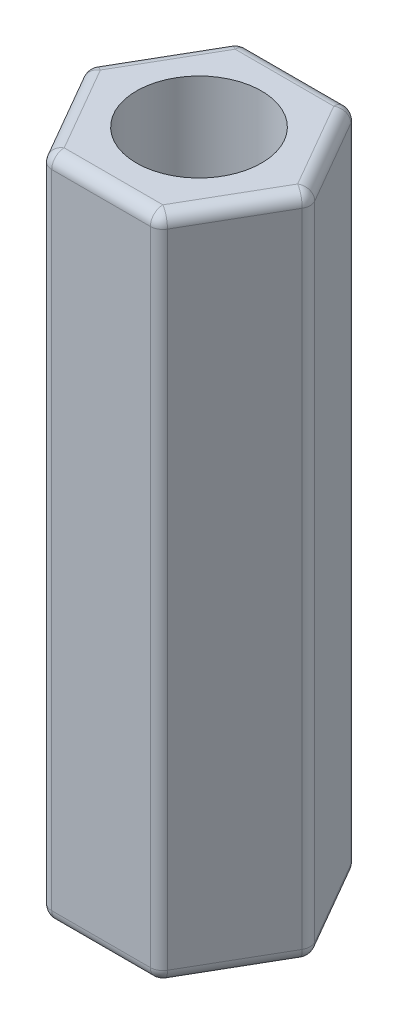
ISO-10303-21;
HEADER;
FILE_DESCRIPTION(('STEP AP214'),'2;1');
FILE_NAME('part.step','',(''),(''),'','','');
FILE_SCHEMA(('AUTOMOTIVE_DESIGN { 1 0 10303 214 1 1 1 1 }'));
ENDSEC;
DATA;
#1=APPLICATION_CONTEXT('core data for automotive mechanical design processes');
#2=APPLICATION_PROTOCOL_DEFINITION('international standard','automotive_design',2000,#1);
#3=PRODUCT_CONTEXT('',#1,'mechanical');
#4=PRODUCT('Part','Part','',(#3));
#5=PRODUCT_RELATED_PRODUCT_CATEGORY('part','',(#4));
#6=PRODUCT_DEFINITION_FORMATION('','',#4);
#7=PRODUCT_DEFINITION_CONTEXT('part definition',#1,'design');
#8=PRODUCT_DEFINITION('design','',#6,#7);
#9=PRODUCT_DEFINITION_SHAPE('','',#8);
#10=(LENGTH_UNIT() NAMED_UNIT(*) SI_UNIT(.MILLI.,.METRE.));
#11=(NAMED_UNIT(*) PLANE_ANGLE_UNIT() SI_UNIT($,.RADIAN.));
#12=(NAMED_UNIT(*) SI_UNIT($,.STERADIAN.) SOLID_ANGLE_UNIT());
#13=UNCERTAINTY_MEASURE_WITH_UNIT(LENGTH_MEASURE(1.E-05),#10,'distance_accuracy_value','');
#14=(GEOMETRIC_REPRESENTATION_CONTEXT(3) GLOBAL_UNCERTAINTY_ASSIGNED_CONTEXT((#13)) GLOBAL_UNIT_ASSIGNED_CONTEXT((#10,
#11,#12)) REPRESENTATION_CONTEXT('',''));
#15=CARTESIAN_POINT('',(0.,0.,0.));
#16=DIRECTION('',(0.,0.,1.));
#17=DIRECTION('',(1.,0.,0.));
#18=AXIS2_PLACEMENT_3D('',#15,#16,#17);
#19=CARTESIAN_POINT('',(0.,16.,0.));
#20=DIRECTION('',(0.,1.,0.));
#21=DIRECTION('',(0.,0.,1.));
#22=AXIS2_PLACEMENT_3D('',#19,#20,#21);
#23=PLANE('',#22);
#24=DIRECTION('',(0.500000000000007,0.,0.866025403784435));
#25=VECTOR('',#24,1.);
#26=CARTESIAN_POINT('',(-1.09696551146027,16.,2.20000000000001));
#27=LINE('',#26,#25);
#28=CARTESIAN_POINT('',(-2.36713610367747,16.,0.));
#29=VERTEX_POINT('',#28);
#30=CARTESIAN_POINT('',(-1.18356805183871,16.,2.05000000000001));
#31=VERTEX_POINT('',#30);
#32=EDGE_CURVE('E255',#29,#31,#27,.T.);
#33=ORIENTED_EDGE('',*,*,#32,.T.);
#34=DIRECTION('',(1.,0.,0.));
#35=VECTOR('',#34,1.);
#36=CARTESIAN_POINT('',(1.35677313259565,16.,2.04999999999999));
#37=LINE('',#36,#35);
#38=CARTESIAN_POINT('',(1.18356805183876,16.,2.04999999999999));
#39=VERTEX_POINT('',#38);
#40=EDGE_CURVE('E257',#31,#39,#37,.T.);
#41=ORIENTED_EDGE('',*,*,#40,.T.);
#42=DIRECTION('',(0.499999999999995,0.,-0.866025403784442));
#43=VECTOR('',#42,1.);
#44=CARTESIAN_POINT('',(2.45373864405591,16.,-0.149999999999999));
#45=LINE('',#44,#43);
#46=CARTESIAN_POINT('',(2.36713610367747,16.,0.));
#47=VERTEX_POINT('',#46);
#48=EDGE_CURVE('E247',#39,#47,#45,.T.);
#49=ORIENTED_EDGE('',*,*,#48,.T.);
#50=DIRECTION('',(-0.500000000000001,0.,-0.866025403784438));
#51=VECTOR('',#50,1.);
#52=CARTESIAN_POINT('',(1.09696551146028,16.,-2.20000000000001));
#53=LINE('',#52,#51);
#54=CARTESIAN_POINT('',(1.18356805183873,16.,-2.05000000000001));
#55=VERTEX_POINT('',#54);
#56=EDGE_CURVE('E249',#47,#55,#53,.T.);
#57=ORIENTED_EDGE('',*,*,#56,.T.);
#58=DIRECTION('',(-1.,0.,0.));
#59=VECTOR('',#58,1.);
#60=CARTESIAN_POINT('',(-1.35677313259563,16.,-2.05));
#61=LINE('',#60,#59);
#62=CARTESIAN_POINT('',(-1.18356805183874,16.,-2.05));
#63=VERTEX_POINT('',#62);
#64=EDGE_CURVE('E251',#55,#63,#61,.T.);
#65=ORIENTED_EDGE('',*,*,#64,.T.);
#66=DIRECTION('',(-0.499999999999995,0.,0.866025403784442));
#67=VECTOR('',#66,1.);
#68=CARTESIAN_POINT('',(-2.45373864405591,16.,0.150000000000018));
#69=LINE('',#68,#67);
#70=EDGE_CURVE('E253',#63,#29,#69,.T.);
#71=ORIENTED_EDGE('',*,*,#70,.T.);
#72=EDGE_LOOP('',(#33,#41,#49,#57,#65,#71));
#73=FACE_BOUND('',#72,.T.);
#74=CARTESIAN_POINT('',(0.,16.,0.));
#75=DIRECTION('',(0.,1.,0.));
#76=DIRECTION('',(0.,0.,1.));
#77=AXIS2_PLACEMENT_3D('',#74,#75,#76);
#78=CIRCLE('',#77,1.5);
#79=CARTESIAN_POINT('',(0.,16.,1.5));
#80=VERTEX_POINT('',#79);
#81=EDGE_CURVE('E194',#80,#80,#78,.T.);
#82=ORIENTED_EDGE('',*,*,#81,.F.);
#83=EDGE_LOOP('',(#82));
#84=FACE_BOUND('',#83,.T.);
#85=ADVANCED_FACE('F37',(#73,#84),#23,.T.);
#86=CARTESIAN_POINT('',(0.,0.,0.));
#87=DIRECTION('',(0.,1.,0.));
#88=DIRECTION('',(0.,0.,1.));
#89=AXIS2_PLACEMENT_3D('',#86,#87,#88);
#90=PLANE('',#89);
#91=DIRECTION('',(0.499999999999995,0.,-0.866025403784442));
#92=VECTOR('',#91,1.);
#93=CARTESIAN_POINT('',(1.77535207775811,0.,1.02499999999999));
#94=LINE('',#93,#92);
#95=CARTESIAN_POINT('',(2.36713610367747,0.,0.));
#96=VERTEX_POINT('',#95);
#97=CARTESIAN_POINT('',(1.18356805183876,0.,2.04999999999999));
#98=VERTEX_POINT('',#97);
#99=EDGE_CURVE('E260',#96,#98,#94,.F.);
#100=ORIENTED_EDGE('',*,*,#99,.T.);
#101=DIRECTION('',(1.,0.,0.));
#102=VECTOR('',#101,1.);
#103=CARTESIAN_POINT('',(0.,0.,2.05));
#104=LINE('',#103,#102);
#105=CARTESIAN_POINT('',(-1.18356805183871,0.,2.05000000000001));
#106=VERTEX_POINT('',#105);
#107=EDGE_CURVE('E11',#98,#106,#104,.F.);
#108=ORIENTED_EDGE('',*,*,#107,.T.);
#109=DIRECTION('',(0.500000000000007,0.,0.866025403784435));
#110=VECTOR('',#109,1.);
#111=CARTESIAN_POINT('',(-1.77535207775809,0.,1.02500000000001));
#112=LINE('',#111,#110);
#113=CARTESIAN_POINT('',(-2.36713610367747,0.,0.));
#114=VERTEX_POINT('',#113);
#115=EDGE_CURVE('E46',#106,#114,#112,.F.);
#116=ORIENTED_EDGE('',*,*,#115,.T.);
#117=DIRECTION('',(-0.499999999999995,0.,0.866025403784442));
#118=VECTOR('',#117,1.);
#119=CARTESIAN_POINT('',(-1.77535207775811,0.,-1.02499999999999));
#120=LINE('',#119,#118);
#121=CARTESIAN_POINT('',(-1.18356805183874,0.,-2.05));
#122=VERTEX_POINT('',#121);
#123=EDGE_CURVE('E266',#114,#122,#120,.F.);
#124=ORIENTED_EDGE('',*,*,#123,.T.);
#125=DIRECTION('',(-1.,0.,0.));
#126=VECTOR('',#125,1.);
#127=CARTESIAN_POINT('',(0.,0.,-2.05));
#128=LINE('',#127,#126);
#129=CARTESIAN_POINT('',(1.18356805183873,0.,-2.05000000000001));
#130=VERTEX_POINT('',#129);
#131=EDGE_CURVE('E264',#122,#130,#128,.F.);
#132=ORIENTED_EDGE('',*,*,#131,.T.);
#133=DIRECTION('',(-0.500000000000001,0.,-0.866025403784438));
#134=VECTOR('',#133,1.);
#135=CARTESIAN_POINT('',(1.7753520777581,0.,-1.025));
#136=LINE('',#135,#134);
#137=EDGE_CURVE('E262',#130,#96,#136,.F.);
#138=ORIENTED_EDGE('',*,*,#137,.T.);
#139=EDGE_LOOP('',(#100,#108,#116,#124,#132,#138));
#140=FACE_BOUND('',#139,.T.);
#141=CARTESIAN_POINT('',(0.,0.,0.));
#142=DIRECTION('',(0.,1.,0.));
#143=DIRECTION('',(0.,0.,1.));
#144=AXIS2_PLACEMENT_3D('',#141,#142,#143);
#145=CIRCLE('',#144,1.5);
#146=CARTESIAN_POINT('',(0.,0.,1.5));
#147=VERTEX_POINT('',#146);
#148=EDGE_CURVE('E358',#147,#147,#145,.T.);
#149=ORIENTED_EDGE('',*,*,#148,.T.);
#150=EDGE_LOOP('',(#149));
#151=FACE_BOUND('',#150,.T.);
#152=ADVANCED_FACE('F375',(#140,#151),#90,.F.);
#153=CARTESIAN_POINT('',(1.35677313259565,16.,2.34999999999999));
#154=DIRECTION('',(-0.866025403784441,0.,-0.499999999999995));
#155=DIRECTION('',(-0.499999999999995,0.,0.866025403784442));
#156=AXIS2_PLACEMENT_3D('',#153,#154,#155);
#157=PLANE('',#156);
#158=DIRECTION('',(0.,-1.,0.));
#159=VECTOR('',#158,1.);
#160=CARTESIAN_POINT('',(2.6269437248128,16.,0.15));
#161=LINE('',#160,#159);
#162=CARTESIAN_POINT('',(2.6269437248128,0.300000000000002,0.15));
#163=VERTEX_POINT('',#162);
#164=CARTESIAN_POINT('',(2.6269437248128,15.7,0.15));
#165=VERTEX_POINT('',#164);
#166=EDGE_CURVE('E171',#163,#165,#161,.F.);
#167=ORIENTED_EDGE('',*,*,#166,.T.);
#168=DIRECTION('',(0.499999999999995,0.,-0.866025403784442));
#169=VECTOR('',#168,1.);
#170=CARTESIAN_POINT('',(1.35677313259565,15.7,2.34999999999999));
#171=LINE('',#170,#169);
#172=CARTESIAN_POINT('',(1.44337567297409,15.7,2.19999999999999));
#173=VERTEX_POINT('',#172);
#174=EDGE_CURVE('E209',#165,#173,#171,.F.);
#175=ORIENTED_EDGE('',*,*,#174,.T.);
#176=DIRECTION('',(0.,-1.,0.));
#177=VECTOR('',#176,1.);
#178=CARTESIAN_POINT('',(1.44337567297409,16.,2.19999999999999));
#179=LINE('',#178,#177);
#180=CARTESIAN_POINT('',(1.44337567297409,0.300000000000002,2.19999999999999));
#181=VERTEX_POINT('',#180);
#182=EDGE_CURVE('E206',#173,#181,#179,.T.);
#183=ORIENTED_EDGE('',*,*,#182,.T.);
#184=DIRECTION('',(0.499999999999995,0.,-0.866025403784442));
#185=VECTOR('',#184,1.);
#186=CARTESIAN_POINT('',(1.35677313259565,0.300000000000002,2.34999999999999));
#187=LINE('',#186,#185);
#188=EDGE_CURVE('E201',#181,#163,#187,.T.);
#189=ORIENTED_EDGE('',*,*,#188,.T.);
#190=EDGE_LOOP('',(#167,#175,#183,#189));
#191=FACE_BOUND('',#190,.T.);
#192=ADVANCED_FACE('F381',(#191),#157,.F.);
#193=CARTESIAN_POINT('',(2.71354626519124,16.,0.));
#194=DIRECTION('',(-0.866025403784438,0.,0.500000000000001));
#195=DIRECTION('',(0.500000000000001,0.,0.866025403784438));
#196=AXIS2_PLACEMENT_3D('',#193,#194,#195);
#197=PLANE('',#196);
#198=DIRECTION('',(0.,-1.,0.));
#199=VECTOR('',#198,1.);
#200=CARTESIAN_POINT('',(1.44337567297406,16.,-2.20000000000001));
#201=LINE('',#200,#199);
#202=CARTESIAN_POINT('',(1.44337567297406,0.300000000000002,-2.20000000000001));
#203=VERTEX_POINT('',#202);
#204=CARTESIAN_POINT('',(1.44337567297406,15.7,-2.20000000000001));
#205=VERTEX_POINT('',#204);
#206=EDGE_CURVE('E193',#203,#205,#201,.F.);
#207=ORIENTED_EDGE('',*,*,#206,.T.);
#208=DIRECTION('',(-0.500000000000001,0.,-0.866025403784438));
#209=VECTOR('',#208,1.);
#210=CARTESIAN_POINT('',(2.71354626519124,15.7,0.));
#211=LINE('',#210,#209);
#212=CARTESIAN_POINT('',(2.6269437248128,15.7,-0.149999999999999));
#213=VERTEX_POINT('',#212);
#214=EDGE_CURVE('E198',#205,#213,#211,.F.);
#215=ORIENTED_EDGE('',*,*,#214,.T.);
#216=DIRECTION('',(0.,-1.,0.));
#217=VECTOR('',#216,1.);
#218=CARTESIAN_POINT('',(2.6269437248128,16.,-0.149999999999999));
#219=LINE('',#218,#217);
#220=CARTESIAN_POINT('',(2.6269437248128,0.300000000000002,-0.149999999999999));
#221=VERTEX_POINT('',#220);
#222=EDGE_CURVE('E169',#213,#221,#219,.T.);
#223=ORIENTED_EDGE('',*,*,#222,.T.);
#224=DIRECTION('',(-0.500000000000001,0.,-0.866025403784438));
#225=VECTOR('',#224,1.);
#226=CARTESIAN_POINT('',(2.71354626519124,0.300000000000002,0.));
#227=LINE('',#226,#225);
#228=EDGE_CURVE('E187',#221,#203,#227,.T.);
#229=ORIENTED_EDGE('',*,*,#228,.T.);
#230=EDGE_LOOP('',(#207,#215,#223,#229));
#231=FACE_BOUND('',#230,.T.);
#232=ADVANCED_FACE('F196',(#231),#197,.F.);
#233=CARTESIAN_POINT('',(1.35677313259562,16.,-2.35000000000001));
#234=DIRECTION('',(0.,0.,1.));
#235=DIRECTION('',(1.,0.,0.));
#236=AXIS2_PLACEMENT_3D('',#233,#234,#235);
#237=PLANE('',#236);
#238=DIRECTION('',(0.,-1.,0.));
#239=VECTOR('',#238,1.);
#240=CARTESIAN_POINT('',(-1.18356805183874,16.,-2.35));
#241=LINE('',#240,#239);
#242=CARTESIAN_POINT('',(-1.18356805183874,0.300000000000002,-2.35));
#243=VERTEX_POINT('',#242);
#244=CARTESIAN_POINT('',(-1.18356805183874,15.7,-2.35));
#245=VERTEX_POINT('',#244);
#246=EDGE_CURVE('E213',#243,#245,#241,.F.);
#247=ORIENTED_EDGE('',*,*,#246,.T.);
#248=DIRECTION('',(-1.,0.,0.));
#249=VECTOR('',#248,1.);
#250=CARTESIAN_POINT('',(1.35677313259562,15.7,-2.35000000000001));
#251=LINE('',#250,#249);
#252=CARTESIAN_POINT('',(1.18356805183873,15.7,-2.35));
#253=VERTEX_POINT('',#252);
#254=EDGE_CURVE('E218',#245,#253,#251,.F.);
#255=ORIENTED_EDGE('',*,*,#254,.T.);
#256=DIRECTION('',(0.,-1.,0.));
#257=VECTOR('',#256,1.);
#258=CARTESIAN_POINT('',(1.18356805183873,16.,-2.35));
#259=LINE('',#258,#257);
#260=CARTESIAN_POINT('',(1.18356805183873,0.300000000000002,-2.35));
#261=VERTEX_POINT('',#260);
#262=EDGE_CURVE('E215',#253,#261,#259,.T.);
#263=ORIENTED_EDGE('',*,*,#262,.T.);
#264=DIRECTION('',(-1.,0.,0.));
#265=VECTOR('',#264,1.);
#266=CARTESIAN_POINT('',(1.35677313259562,0.300000000000002,-2.35000000000001));
#267=LINE('',#266,#265);
#268=EDGE_CURVE('E211',#261,#243,#267,.T.);
#269=ORIENTED_EDGE('',*,*,#268,.T.);
#270=EDGE_LOOP('',(#247,#255,#263,#269));
#271=FACE_BOUND('',#270,.T.);
#272=ADVANCED_FACE('F396',(#271),#237,.F.);
#273=CARTESIAN_POINT('',(-1.35677313259563,16.,-2.35));
#274=DIRECTION('',(0.866025403784442,0.,0.499999999999995));
#275=DIRECTION('',(0.499999999999995,0.,-0.866025403784442));
#276=AXIS2_PLACEMENT_3D('',#273,#274,#275);
#277=PLANE('',#276);
#278=DIRECTION('',(0.,-1.,0.));
#279=VECTOR('',#278,1.);
#280=CARTESIAN_POINT('',(-2.6269437248128,16.,-0.149999999999982));
#281=LINE('',#280,#279);
#282=CARTESIAN_POINT('',(-2.6269437248128,0.300000000000002,-0.149999999999981));
#283=VERTEX_POINT('',#282);
#284=CARTESIAN_POINT('',(-2.6269437248128,15.7,-0.149999999999981));
#285=VERTEX_POINT('',#284);
#286=EDGE_CURVE('E222',#283,#285,#281,.F.);
#287=ORIENTED_EDGE('',*,*,#286,.T.);
#288=DIRECTION('',(-0.499999999999995,0.,0.866025403784442));
#289=VECTOR('',#288,1.);
#290=CARTESIAN_POINT('',(-1.35677313259563,15.7,-2.35));
#291=LINE('',#290,#289);
#292=CARTESIAN_POINT('',(-1.44337567297408,15.7,-2.19999999999999));
#293=VERTEX_POINT('',#292);
#294=EDGE_CURVE('E227',#285,#293,#291,.F.);
#295=ORIENTED_EDGE('',*,*,#294,.T.);
#296=DIRECTION('',(0.,-1.,0.));
#297=VECTOR('',#296,1.);
#298=CARTESIAN_POINT('',(-1.44337567297408,16.,-2.19999999999999));
#299=LINE('',#298,#297);
#300=CARTESIAN_POINT('',(-1.44337567297408,0.300000000000002,-2.19999999999999));
#301=VERTEX_POINT('',#300);
#302=EDGE_CURVE('E224',#293,#301,#299,.T.);
#303=ORIENTED_EDGE('',*,*,#302,.T.);
#304=DIRECTION('',(-0.499999999999995,0.,0.866025403784442));
#305=VECTOR('',#304,1.);
#306=CARTESIAN_POINT('',(-1.35677313259563,0.300000000000002,-2.35));
#307=LINE('',#306,#305);
#308=EDGE_CURVE('E220',#301,#283,#307,.T.);
#309=ORIENTED_EDGE('',*,*,#308,.T.);
#310=EDGE_LOOP('',(#287,#295,#303,#309));
#311=FACE_BOUND('',#310,.T.);
#312=ADVANCED_FACE('F392',(#311),#277,.F.);
#313=CARTESIAN_POINT('',(-2.71354626519124,16.,0.));
#314=DIRECTION('',(0.866025403784435,0.,-0.500000000000007));
#315=DIRECTION('',(-0.500000000000007,0.,-0.866025403784435));
#316=AXIS2_PLACEMENT_3D('',#313,#314,#315);
#317=PLANE('',#316);
#318=DIRECTION('',(0.,-1.,0.));
#319=VECTOR('',#318,1.);
#320=CARTESIAN_POINT('',(-1.44337567297404,16.,2.20000000000001));
#321=LINE('',#320,#319);
#322=CARTESIAN_POINT('',(-1.44337567297405,0.300000000000002,2.20000000000001));
#323=VERTEX_POINT('',#322);
#324=CARTESIAN_POINT('',(-1.44337567297405,15.7,2.20000000000001));
#325=VERTEX_POINT('',#324);
#326=EDGE_CURVE('E231',#323,#325,#321,.F.);
#327=ORIENTED_EDGE('',*,*,#326,.T.);
#328=DIRECTION('',(0.500000000000007,0.,0.866025403784435));
#329=VECTOR('',#328,1.);
#330=CARTESIAN_POINT('',(-2.71354626519124,15.7,0.));
#331=LINE('',#330,#329);
#332=CARTESIAN_POINT('',(-2.6269437248128,15.7,0.150000000000019));
#333=VERTEX_POINT('',#332);
#334=EDGE_CURVE('E236',#325,#333,#331,.F.);
#335=ORIENTED_EDGE('',*,*,#334,.T.);
#336=DIRECTION('',(0.,-1.,0.));
#337=VECTOR('',#336,1.);
#338=CARTESIAN_POINT('',(-2.6269437248128,16.,0.150000000000019));
#339=LINE('',#338,#337);
#340=CARTESIAN_POINT('',(-2.6269437248128,0.300000000000002,0.150000000000019));
#341=VERTEX_POINT('',#340);
#342=EDGE_CURVE('E233',#333,#341,#339,.T.);
#343=ORIENTED_EDGE('',*,*,#342,.T.);
#344=DIRECTION('',(0.500000000000007,0.,0.866025403784435));
#345=VECTOR('',#344,1.);
#346=CARTESIAN_POINT('',(-2.71354626519124,0.300000000000002,0.));
#347=LINE('',#346,#345);
#348=EDGE_CURVE('E229',#341,#323,#347,.T.);
#349=ORIENTED_EDGE('',*,*,#348,.T.);
#350=EDGE_LOOP('',(#327,#335,#343,#349));
#351=FACE_BOUND('',#350,.T.);
#352=ADVANCED_FACE('F388',(#351),#317,.F.);
#353=CARTESIAN_POINT('',(-1.3567731325956,16.,2.35000000000001));
#354=DIRECTION('',(0.,0.,-1.));
#355=DIRECTION('',(-1.,0.,0.));
#356=AXIS2_PLACEMENT_3D('',#353,#354,#355);
#357=PLANE('',#356);
#358=DIRECTION('',(0.,-1.,0.));
#359=VECTOR('',#358,1.);
#360=CARTESIAN_POINT('',(1.18356805183876,16.,2.34999999999999));
#361=LINE('',#360,#359);
#362=CARTESIAN_POINT('',(1.18356805183876,0.300000000000002,2.34999999999999));
#363=VERTEX_POINT('',#362);
#364=CARTESIAN_POINT('',(1.18356805183876,15.7,2.34999999999999));
#365=VERTEX_POINT('',#364);
#366=EDGE_CURVE('E240',#363,#365,#361,.F.);
#367=ORIENTED_EDGE('',*,*,#366,.T.);
#368=DIRECTION('',(1.,0.,0.));
#369=VECTOR('',#368,1.);
#370=CARTESIAN_POINT('',(-1.3567731325956,15.7,2.35000000000001));
#371=LINE('',#370,#369);
#372=CARTESIAN_POINT('',(-1.18356805183871,15.7,2.35000000000001));
#373=VERTEX_POINT('',#372);
#374=EDGE_CURVE('E245',#365,#373,#371,.F.);
#375=ORIENTED_EDGE('',*,*,#374,.T.);
#376=DIRECTION('',(0.,-1.,0.));
#377=VECTOR('',#376,1.);
#378=CARTESIAN_POINT('',(-1.18356805183871,16.,2.35000000000001));
#379=LINE('',#378,#377);
#380=CARTESIAN_POINT('',(-1.18356805183871,0.300000000000002,2.35000000000001));
#381=VERTEX_POINT('',#380);
#382=EDGE_CURVE('E242',#373,#381,#379,.T.);
#383=ORIENTED_EDGE('',*,*,#382,.T.);
#384=DIRECTION('',(1.,0.,0.));
#385=VECTOR('',#384,1.);
#386=CARTESIAN_POINT('',(-1.3567731325956,0.300000000000002,2.35000000000001));
#387=LINE('',#386,#385);
#388=EDGE_CURVE('E238',#381,#363,#387,.T.);
#389=ORIENTED_EDGE('',*,*,#388,.T.);
#390=EDGE_LOOP('',(#367,#375,#383,#389));
#391=FACE_BOUND('',#390,.T.);
#392=ADVANCED_FACE('F385',(#391),#357,.F.);
#393=CARTESIAN_POINT('',(0.,16.,0.));
#394=DIRECTION('',(0.,-1.,0.));
#395=DIRECTION('',(0.,0.,-1.));
#396=AXIS2_PLACEMENT_3D('',#393,#394,#395);
#397=CYLINDRICAL_SURFACE('',#396,1.5);
#398=ORIENTED_EDGE('',*,*,#81,.T.);
#399=EDGE_LOOP('',(#398));
#400=FACE_BOUND('',#399,.T.);
#401=ORIENTED_EDGE('',*,*,#148,.F.);
#402=EDGE_LOOP('',(#401));
#403=FACE_BOUND('',#402,.T.);
#404=ADVANCED_FACE('F371',(#400,#403),#397,.F.);
#405=CARTESIAN_POINT('',(-2.36713610367747,16.,0.));
#406=DIRECTION('',(0.,-1.,0.));
#407=DIRECTION('',(0.,0.,-1.));
#408=AXIS2_PLACEMENT_3D('',#405,#406,#407);
#409=CYLINDRICAL_SURFACE('',#408,0.3);
#410=CARTESIAN_POINT('',(-2.36713610367747,15.7,0.));
#411=DIRECTION('',(0.,1.,0.));
#412=DIRECTION('',(0.,0.,1.));
#413=AXIS2_PLACEMENT_3D('',#410,#411,#412);
#414=CIRCLE('',#413,0.3);
#415=EDGE_CURVE('E41',#285,#333,#414,.T.);
#416=ORIENTED_EDGE('',*,*,#415,.F.);
#417=ORIENTED_EDGE('',*,*,#286,.F.);
#418=CARTESIAN_POINT('',(-2.36713610367747,0.300000000000002,0.));
#419=DIRECTION('',(0.,-1.,0.));
#420=DIRECTION('',(0.,0.,-1.));
#421=AXIS2_PLACEMENT_3D('',#418,#419,#420);
#422=CIRCLE('',#421,0.3);
#423=EDGE_CURVE('E351',#341,#283,#422,.T.);
#424=ORIENTED_EDGE('',*,*,#423,.F.);
#425=ORIENTED_EDGE('',*,*,#342,.F.);
#426=EDGE_LOOP('',(#416,#417,#424,#425));
#427=FACE_BOUND('',#426,.T.);
#428=ADVANCED_FACE('F39',(#427),#409,.T.);
#429=CARTESIAN_POINT('',(-2.36713610367747,15.7,0.));
#430=DIRECTION('',(0.,0.,1.));
#431=DIRECTION('',(1.,0.,0.));
#432=AXIS2_PLACEMENT_3D('',#429,#430,#431);
#433=SPHERICAL_SURFACE('',#432,0.3);
#434=CARTESIAN_POINT('',(-2.36713610367747,15.7,0.));
#435=DIRECTION('',(-0.499999999999994,0.,0.866025403784442));
#436=DIRECTION('',(0.866025403784442,0.,0.499999999999994));
#437=AXIS2_PLACEMENT_3D('',#434,#435,#436);
#438=CIRCLE('',#437,0.3);
#439=EDGE_CURVE('E346',#285,#29,#438,.F.);
#440=ORIENTED_EDGE('',*,*,#439,.F.);
#441=ORIENTED_EDGE('',*,*,#415,.T.);
#442=CARTESIAN_POINT('',(-2.36713610367747,15.7,0.));
#443=DIRECTION('',(-0.500000000000007,0.,-0.866025403784435));
#444=DIRECTION('',(-0.866025403784435,0.,0.500000000000007));
#445=AXIS2_PLACEMENT_3D('',#442,#443,#444);
#446=CIRCLE('',#445,0.3);
#447=EDGE_CURVE('E349',#29,#333,#446,.F.);
#448=ORIENTED_EDGE('',*,*,#447,.F.);
#449=EDGE_LOOP('',(#440,#441,#448));
#450=FACE_BOUND('',#449,.T.);
#451=ADVANCED_FACE('F509',(#450),#433,.T.);
#452=CARTESIAN_POINT('',(-2.36713610367747,0.3,0.));
#453=DIRECTION('',(0.,0.,1.));
#454=DIRECTION('',(1.,0.,0.));
#455=AXIS2_PLACEMENT_3D('',#452,#453,#454);
#456=SPHERICAL_SURFACE('',#455,0.3);
#457=CARTESIAN_POINT('',(-2.36713610367747,0.3,0.));
#458=DIRECTION('',(-0.500000000000007,0.,-0.866025403784435));
#459=DIRECTION('',(-0.866025403784435,0.,0.500000000000007));
#460=AXIS2_PLACEMENT_3D('',#457,#458,#459);
#461=CIRCLE('',#460,0.3);
#462=EDGE_CURVE('E341',#341,#114,#461,.F.);
#463=ORIENTED_EDGE('',*,*,#462,.F.);
#464=ORIENTED_EDGE('',*,*,#423,.T.);
#465=CARTESIAN_POINT('',(-2.36713610367747,0.300000000000002,0.));
#466=DIRECTION('',(-0.499999999999995,0.,0.866025403784442));
#467=DIRECTION('',(0.866025403784442,0.,0.499999999999995));
#468=AXIS2_PLACEMENT_3D('',#465,#466,#467);
#469=CIRCLE('',#468,0.3);
#470=EDGE_CURVE('E343',#114,#283,#469,.F.);
#471=ORIENTED_EDGE('',*,*,#470,.F.);
#472=EDGE_LOOP('',(#463,#464,#471));
#473=FACE_BOUND('',#472,.T.);
#474=ADVANCED_FACE('F506',(#473),#456,.T.);
#475=CARTESIAN_POINT('',(-1.77535207775809,15.7,1.02500000000001));
#476=DIRECTION('',(-0.500000000000007,0.,-0.866025403784435));
#477=DIRECTION('',(-0.866025403784435,0.,0.500000000000007));
#478=AXIS2_PLACEMENT_3D('',#475,#476,#477);
#479=CYLINDRICAL_SURFACE('',#478,0.3);
#480=ORIENTED_EDGE('',*,*,#447,.T.);
#481=ORIENTED_EDGE('',*,*,#334,.F.);
#482=CARTESIAN_POINT('',(-1.18356805183871,15.7,2.05000000000001));
#483=DIRECTION('',(0.500000000000007,0.,0.866025403784434));
#484=DIRECTION('',(0.866025403784435,0.,-0.500000000000007));
#485=AXIS2_PLACEMENT_3D('',#482,#483,#484);
#486=CIRCLE('',#485,0.3);
#487=EDGE_CURVE('E335',#31,#325,#486,.T.);
#488=ORIENTED_EDGE('',*,*,#487,.F.);
#489=ORIENTED_EDGE('',*,*,#32,.F.);
#490=EDGE_LOOP('',(#480,#481,#488,#489));
#491=FACE_BOUND('',#490,.T.);
#492=ADVANCED_FACE('F502',(#491),#479,.T.);
#493=CARTESIAN_POINT('',(-1.77535207775811,15.7,-1.02499999999999));
#494=DIRECTION('',(0.499999999999995,0.,-0.866025403784442));
#495=DIRECTION('',(-0.866025403784442,0.,-0.499999999999995));
#496=AXIS2_PLACEMENT_3D('',#493,#494,#495);
#497=CYLINDRICAL_SURFACE('',#496,0.3);
#498=ORIENTED_EDGE('',*,*,#439,.T.);
#499=ORIENTED_EDGE('',*,*,#70,.F.);
#500=CARTESIAN_POINT('',(-1.18356805183874,15.7,-2.05));
#501=DIRECTION('',(0.499999999999995,0.,-0.866025403784441));
#502=DIRECTION('',(-0.866025403784441,0.,-0.499999999999995));
#503=AXIS2_PLACEMENT_3D('',#500,#501,#502);
#504=CIRCLE('',#503,0.3);
#505=EDGE_CURVE('E332',#293,#63,#504,.T.);
#506=ORIENTED_EDGE('',*,*,#505,.F.);
#507=ORIENTED_EDGE('',*,*,#294,.F.);
#508=EDGE_LOOP('',(#498,#499,#506,#507));
#509=FACE_BOUND('',#508,.T.);
#510=ADVANCED_FACE('F498',(#509),#497,.T.);
#511=CARTESIAN_POINT('',(-1.18356805183874,16.,-2.05));
#512=DIRECTION('',(0.,-1.,0.));
#513=DIRECTION('',(0.,0.,-1.));
#514=AXIS2_PLACEMENT_3D('',#511,#512,#513);
#515=CYLINDRICAL_SURFACE('',#514,0.3);
#516=CARTESIAN_POINT('',(-1.18356805183874,0.300000000000002,-2.05));
#517=DIRECTION('',(0.,-1.,0.));
#518=DIRECTION('',(0.,0.,-1.));
#519=AXIS2_PLACEMENT_3D('',#516,#517,#518);
#520=CIRCLE('',#519,0.3);
#521=EDGE_CURVE('E326',#301,#243,#520,.T.);
#522=ORIENTED_EDGE('',*,*,#521,.F.);
#523=ORIENTED_EDGE('',*,*,#302,.F.);
#524=CARTESIAN_POINT('',(-1.18356805183874,15.7,-2.05));
#525=DIRECTION('',(0.,1.,0.));
#526=DIRECTION('',(0.,0.,1.));
#527=AXIS2_PLACEMENT_3D('',#524,#525,#526);
#528=CIRCLE('',#527,0.3);
#529=EDGE_CURVE('E329',#245,#293,#528,.T.);
#530=ORIENTED_EDGE('',*,*,#529,.F.);
#531=ORIENTED_EDGE('',*,*,#246,.F.);
#532=EDGE_LOOP('',(#522,#523,#530,#531));
#533=FACE_BOUND('',#532,.T.);
#534=ADVANCED_FACE('F494',(#533),#515,.T.);
#535=CARTESIAN_POINT('',(-1.0969655114603,0.300000000000002,-2.2));
#536=DIRECTION('',(-0.499999999999995,0.,0.866025403784442));
#537=DIRECTION('',(0.866025403784442,0.,0.499999999999995));
#538=AXIS2_PLACEMENT_3D('',#535,#536,#537);
#539=CYLINDRICAL_SURFACE('',#538,0.3);
#540=ORIENTED_EDGE('',*,*,#470,.T.);
#541=ORIENTED_EDGE('',*,*,#308,.F.);
#542=CARTESIAN_POINT('',(-1.18356805183874,0.3,-2.05));
#543=DIRECTION('',(0.499999999999995,0.,-0.866025403784441));
#544=DIRECTION('',(-0.866025403784441,0.,-0.499999999999995));
#545=AXIS2_PLACEMENT_3D('',#542,#543,#544);
#546=CIRCLE('',#545,0.3);
#547=EDGE_CURVE('E324',#122,#301,#546,.T.);
#548=ORIENTED_EDGE('',*,*,#547,.F.);
#549=ORIENTED_EDGE('',*,*,#123,.F.);
#550=EDGE_LOOP('',(#540,#541,#548,#549));
#551=FACE_BOUND('',#550,.T.);
#552=ADVANCED_FACE('F490',(#551),#539,.T.);
#553=CARTESIAN_POINT('',(-2.45373864405591,0.300000000000002,-0.149999999999983));
#554=DIRECTION('',(0.500000000000007,0.,0.866025403784435));
#555=DIRECTION('',(0.866025403784435,0.,-0.500000000000007));
#556=AXIS2_PLACEMENT_3D('',#553,#554,#555);
#557=CYLINDRICAL_SURFACE('',#556,0.3);
#558=ORIENTED_EDGE('',*,*,#462,.T.);
#559=ORIENTED_EDGE('',*,*,#115,.F.);
#560=CARTESIAN_POINT('',(-1.18356805183871,0.300000000000002,2.05000000000001));
#561=DIRECTION('',(0.500000000000007,0.,0.866025403784435));
#562=DIRECTION('',(0.866025403784435,0.,-0.500000000000007));
#563=AXIS2_PLACEMENT_3D('',#560,#561,#562);
#564=CIRCLE('',#563,0.3);
#565=EDGE_CURVE('E322',#323,#106,#564,.T.);
#566=ORIENTED_EDGE('',*,*,#565,.F.);
#567=ORIENTED_EDGE('',*,*,#348,.F.);
#568=EDGE_LOOP('',(#558,#559,#566,#567));
#569=FACE_BOUND('',#568,.T.);
#570=ADVANCED_FACE('F486',(#569),#557,.T.);
#571=CARTESIAN_POINT('',(-1.18356805183871,16.,2.05000000000001));
#572=DIRECTION('',(0.,-1.,0.));
#573=DIRECTION('',(0.,0.,-1.));
#574=AXIS2_PLACEMENT_3D('',#571,#572,#573);
#575=CYLINDRICAL_SURFACE('',#574,0.3);
#576=CARTESIAN_POINT('',(-1.18356805183871,15.7,2.05000000000001));
#577=DIRECTION('',(0.,1.,0.));
#578=DIRECTION('',(0.,0.,1.));
#579=AXIS2_PLACEMENT_3D('',#576,#577,#578);
#580=CIRCLE('',#579,0.3);
#581=EDGE_CURVE('E338',#325,#373,#580,.T.);
#582=ORIENTED_EDGE('',*,*,#581,.F.);
#583=ORIENTED_EDGE('',*,*,#326,.F.);
#584=CARTESIAN_POINT('',(-1.18356805183871,0.300000000000002,2.05000000000001));
#585=DIRECTION('',(0.,-1.,0.));
#586=DIRECTION('',(0.,0.,-1.));
#587=AXIS2_PLACEMENT_3D('',#584,#585,#586);
#588=CIRCLE('',#587,0.3);
#589=EDGE_CURVE('E319',#381,#323,#588,.T.);
#590=ORIENTED_EDGE('',*,*,#589,.F.);
#591=ORIENTED_EDGE('',*,*,#382,.F.);
#592=EDGE_LOOP('',(#582,#583,#590,#591));
#593=FACE_BOUND('',#592,.T.);
#594=ADVANCED_FACE('F482',(#593),#575,.T.);
#595=CARTESIAN_POINT('',(-1.18356805183871,15.7,2.05000000000001));
#596=DIRECTION('',(0.,0.,1.));
#597=DIRECTION('',(1.,0.,0.));
#598=AXIS2_PLACEMENT_3D('',#595,#596,#597);
#599=SPHERICAL_SURFACE('',#598,0.3);
#600=ORIENTED_EDGE('',*,*,#487,.T.);
#601=ORIENTED_EDGE('',*,*,#581,.T.);
#602=CARTESIAN_POINT('',(-1.18356805183871,15.7,2.05000000000001));
#603=DIRECTION('',(-1.,0.,0.));
#604=DIRECTION('',(0.,0.,1.));
#605=AXIS2_PLACEMENT_3D('',#602,#603,#604);
#606=CIRCLE('',#605,0.3);
#607=EDGE_CURVE('E316',#31,#373,#606,.F.);
#608=ORIENTED_EDGE('',*,*,#607,.F.);
#609=EDGE_LOOP('',(#600,#601,#608));
#610=FACE_BOUND('',#609,.T.);
#611=ADVANCED_FACE('F478',(#610),#599,.T.);
#612=CARTESIAN_POINT('',(-1.18356805183874,15.7,-2.05));
#613=DIRECTION('',(0.,0.,1.));
#614=DIRECTION('',(1.,0.,0.));
#615=AXIS2_PLACEMENT_3D('',#612,#613,#614);
#616=SPHERICAL_SURFACE('',#615,0.3);
#617=ORIENTED_EDGE('',*,*,#529,.T.);
#618=ORIENTED_EDGE('',*,*,#505,.T.);
#619=CARTESIAN_POINT('',(-1.18356805183874,15.7,-2.05));
#620=DIRECTION('',(-1.,0.,0.));
#621=DIRECTION('',(0.,0.,1.));
#622=AXIS2_PLACEMENT_3D('',#619,#620,#621);
#623=CIRCLE('',#622,0.3);
#624=EDGE_CURVE('E313',#245,#63,#623,.F.);
#625=ORIENTED_EDGE('',*,*,#624,.F.);
#626=EDGE_LOOP('',(#617,#618,#625));
#627=FACE_BOUND('',#626,.T.);
#628=ADVANCED_FACE('F474',(#627),#616,.T.);
#629=CARTESIAN_POINT('',(-1.18356805183874,0.3,-2.05));
#630=DIRECTION('',(0.,0.,1.));
#631=DIRECTION('',(1.,0.,0.));
#632=AXIS2_PLACEMENT_3D('',#629,#630,#631);
#633=SPHERICAL_SURFACE('',#632,0.3);
#634=ORIENTED_EDGE('',*,*,#547,.T.);
#635=ORIENTED_EDGE('',*,*,#521,.T.);
#636=CARTESIAN_POINT('',(-1.18356805183874,0.300000000000002,-2.05));
#637=DIRECTION('',(-1.,0.,0.));
#638=DIRECTION('',(0.,0.,1.));
#639=AXIS2_PLACEMENT_3D('',#636,#637,#638);
#640=CIRCLE('',#639,0.3);
#641=EDGE_CURVE('E310',#122,#243,#640,.F.);
#642=ORIENTED_EDGE('',*,*,#641,.F.);
#643=EDGE_LOOP('',(#634,#635,#642));
#644=FACE_BOUND('',#643,.T.);
#645=ADVANCED_FACE('F470',(#644),#633,.T.);
#646=CARTESIAN_POINT('',(-1.18356805183871,0.3,2.05000000000001));
#647=DIRECTION('',(0.,0.,1.));
#648=DIRECTION('',(1.,0.,0.));
#649=AXIS2_PLACEMENT_3D('',#646,#647,#648);
#650=SPHERICAL_SURFACE('',#649,0.3);
#651=ORIENTED_EDGE('',*,*,#589,.T.);
#652=ORIENTED_EDGE('',*,*,#565,.T.);
#653=CARTESIAN_POINT('',(-1.18356805183871,0.3,2.05000000000001));
#654=DIRECTION('',(-1.,0.,0.));
#655=DIRECTION('',(0.,0.,1.));
#656=AXIS2_PLACEMENT_3D('',#653,#654,#655);
#657=CIRCLE('',#656,0.3);
#658=EDGE_CURVE('E54',#381,#106,#657,.F.);
#659=ORIENTED_EDGE('',*,*,#658,.F.);
#660=EDGE_LOOP('',(#651,#652,#659));
#661=FACE_BOUND('',#660,.T.);
#662=ADVANCED_FACE('F466',(#661),#650,.T.);
#663=CARTESIAN_POINT('',(0.,15.7,2.05));
#664=DIRECTION('',(-1.,0.,0.));
#665=DIRECTION('',(0.,0.,1.));
#666=AXIS2_PLACEMENT_3D('',#663,#664,#665);
#667=CYLINDRICAL_SURFACE('',#666,0.3);
#668=ORIENTED_EDGE('',*,*,#607,.T.);
#669=ORIENTED_EDGE('',*,*,#374,.F.);
#670=CARTESIAN_POINT('',(1.18356805183876,15.7,2.04999999999999));
#671=DIRECTION('',(1.,0.,0.));
#672=DIRECTION('',(0.,0.,-1.));
#673=AXIS2_PLACEMENT_3D('',#670,#671,#672);
#674=CIRCLE('',#673,0.3);
#675=EDGE_CURVE('E303',#39,#365,#674,.T.);
#676=ORIENTED_EDGE('',*,*,#675,.F.);
#677=ORIENTED_EDGE('',*,*,#40,.F.);
#678=EDGE_LOOP('',(#668,#669,#676,#677));
#679=FACE_BOUND('',#678,.T.);
#680=ADVANCED_FACE('F462',(#679),#667,.T.);
#681=CARTESIAN_POINT('',(0.,15.7,-2.05));
#682=DIRECTION('',(1.,0.,0.));
#683=DIRECTION('',(0.,0.,-1.));
#684=AXIS2_PLACEMENT_3D('',#681,#682,#683);
#685=CYLINDRICAL_SURFACE('',#684,0.3);
#686=ORIENTED_EDGE('',*,*,#624,.T.);
#687=ORIENTED_EDGE('',*,*,#64,.F.);
#688=CARTESIAN_POINT('',(1.18356805183873,15.7,-2.05000000000001));
#689=DIRECTION('',(1.,0.,0.));
#690=DIRECTION('',(0.,0.,-1.));
#691=AXIS2_PLACEMENT_3D('',#688,#689,#690);
#692=CIRCLE('',#691,0.3);
#693=EDGE_CURVE('E300',#253,#55,#692,.T.);
#694=ORIENTED_EDGE('',*,*,#693,.F.);
#695=ORIENTED_EDGE('',*,*,#254,.F.);
#696=EDGE_LOOP('',(#686,#687,#694,#695));
#697=FACE_BOUND('',#696,.T.);
#698=ADVANCED_FACE('F458',(#697),#685,.T.);
#699=CARTESIAN_POINT('',(1.18356805183873,16.,-2.05000000000001));
#700=DIRECTION('',(0.,-1.,0.));
#701=DIRECTION('',(0.,0.,-1.));
#702=AXIS2_PLACEMENT_3D('',#699,#700,#701);
#703=CYLINDRICAL_SURFACE('',#702,0.3);
#704=CARTESIAN_POINT('',(1.18356805183873,0.300000000000002,-2.05000000000001));
#705=DIRECTION('',(0.,-1.,0.));
#706=DIRECTION('',(0.,0.,-1.));
#707=AXIS2_PLACEMENT_3D('',#704,#705,#706);
#708=CIRCLE('',#707,0.3);
#709=EDGE_CURVE('E294',#261,#203,#708,.T.);
#710=ORIENTED_EDGE('',*,*,#709,.F.);
#711=ORIENTED_EDGE('',*,*,#262,.F.);
#712=CARTESIAN_POINT('',(1.18356805183873,15.7,-2.05000000000001));
#713=DIRECTION('',(0.,1.,0.));
#714=DIRECTION('',(0.,0.,1.));
#715=AXIS2_PLACEMENT_3D('',#712,#713,#714);
#716=CIRCLE('',#715,0.3);
#717=EDGE_CURVE('E297',#205,#253,#716,.T.);
#718=ORIENTED_EDGE('',*,*,#717,.F.);
#719=ORIENTED_EDGE('',*,*,#206,.F.);
#720=EDGE_LOOP('',(#710,#711,#718,#719));
#721=FACE_BOUND('',#720,.T.);
#722=ADVANCED_FACE('F454',(#721),#703,.T.);
#723=CARTESIAN_POINT('',(1.35677313259562,0.300000000000002,-2.05000000000001));
#724=DIRECTION('',(-1.,0.,0.));
#725=DIRECTION('',(0.,0.,1.));
#726=AXIS2_PLACEMENT_3D('',#723,#724,#725);
#727=CYLINDRICAL_SURFACE('',#726,0.3);
#728=ORIENTED_EDGE('',*,*,#641,.T.);
#729=ORIENTED_EDGE('',*,*,#268,.F.);
#730=CARTESIAN_POINT('',(1.18356805183873,0.3,-2.05000000000001));
#731=DIRECTION('',(1.,0.,0.));
#732=DIRECTION('',(0.,0.,-1.));
#733=AXIS2_PLACEMENT_3D('',#730,#731,#732);
#734=CIRCLE('',#733,0.3);
#735=EDGE_CURVE('E292',#130,#261,#734,.T.);
#736=ORIENTED_EDGE('',*,*,#735,.F.);
#737=ORIENTED_EDGE('',*,*,#131,.F.);
#738=EDGE_LOOP('',(#728,#729,#736,#737));
#739=FACE_BOUND('',#738,.T.);
#740=ADVANCED_FACE('F451',(#739),#727,.T.);
#741=CARTESIAN_POINT('',(-1.3567731325956,0.300000000000002,2.05000000000001));
#742=DIRECTION('',(1.,0.,0.));
#743=DIRECTION('',(0.,0.,-1.));
#744=AXIS2_PLACEMENT_3D('',#741,#742,#743);
#745=CYLINDRICAL_SURFACE('',#744,0.3);
#746=ORIENTED_EDGE('',*,*,#658,.T.);
#747=ORIENTED_EDGE('',*,*,#107,.F.);
#748=CARTESIAN_POINT('',(1.18356805183876,0.300000000000002,2.04999999999999));
#749=DIRECTION('',(1.,0.,0.));
#750=DIRECTION('',(0.,0.,-1.));
#751=AXIS2_PLACEMENT_3D('',#748,#749,#750);
#752=CIRCLE('',#751,0.3);
#753=EDGE_CURVE('E289',#363,#98,#752,.T.);
#754=ORIENTED_EDGE('',*,*,#753,.F.);
#755=ORIENTED_EDGE('',*,*,#388,.F.);
#756=EDGE_LOOP('',(#746,#747,#754,#755));
#757=FACE_BOUND('',#756,.T.);
#758=ADVANCED_FACE('F447',(#757),#745,.T.);
#759=CARTESIAN_POINT('',(1.18356805183876,16.,2.04999999999999));
#760=DIRECTION('',(0.,-1.,0.));
#761=DIRECTION('',(0.,0.,-1.));
#762=AXIS2_PLACEMENT_3D('',#759,#760,#761);
#763=CYLINDRICAL_SURFACE('',#762,0.3);
#764=CARTESIAN_POINT('',(1.18356805183876,15.7,2.04999999999999));
#765=DIRECTION('',(0.,1.,0.));
#766=DIRECTION('',(0.,0.,1.));
#767=AXIS2_PLACEMENT_3D('',#764,#765,#766);
#768=CIRCLE('',#767,0.3);
#769=EDGE_CURVE('E306',#365,#173,#768,.T.);
#770=ORIENTED_EDGE('',*,*,#769,.F.);
#771=ORIENTED_EDGE('',*,*,#366,.F.);
#772=CARTESIAN_POINT('',(1.18356805183876,0.300000000000002,2.04999999999999));
#773=DIRECTION('',(0.,-1.,0.));
#774=DIRECTION('',(0.,0.,-1.));
#775=AXIS2_PLACEMENT_3D('',#772,#773,#774);
#776=CIRCLE('',#775,0.3);
#777=EDGE_CURVE('E286',#181,#363,#776,.T.);
#778=ORIENTED_EDGE('',*,*,#777,.F.);
#779=ORIENTED_EDGE('',*,*,#182,.F.);
#780=EDGE_LOOP('',(#770,#771,#778,#779));
#781=FACE_BOUND('',#780,.T.);
#782=ADVANCED_FACE('F443',(#781),#763,.T.);
#783=CARTESIAN_POINT('',(1.18356805183876,15.7,2.04999999999999));
#784=DIRECTION('',(0.,0.,1.));
#785=DIRECTION('',(1.,0.,0.));
#786=AXIS2_PLACEMENT_3D('',#783,#784,#785);
#787=SPHERICAL_SURFACE('',#786,0.3);
#788=ORIENTED_EDGE('',*,*,#675,.T.);
#789=ORIENTED_EDGE('',*,*,#769,.T.);
#790=CARTESIAN_POINT('',(1.18356805183876,15.7,2.04999999999999));
#791=DIRECTION('',(-0.499999999999996,0.,0.866025403784441));
#792=DIRECTION('',(0.866025403784441,0.,0.499999999999996));
#793=AXIS2_PLACEMENT_3D('',#790,#791,#792);
#794=CIRCLE('',#793,0.3);
#795=EDGE_CURVE('E283',#39,#173,#794,.F.);
#796=ORIENTED_EDGE('',*,*,#795,.F.);
#797=EDGE_LOOP('',(#788,#789,#796));
#798=FACE_BOUND('',#797,.T.);
#799=ADVANCED_FACE('F439',(#798),#787,.T.);
#800=CARTESIAN_POINT('',(1.18356805183873,15.7,-2.05000000000001));
#801=DIRECTION('',(0.,0.,1.));
#802=DIRECTION('',(1.,0.,0.));
#803=AXIS2_PLACEMENT_3D('',#800,#801,#802);
#804=SPHERICAL_SURFACE('',#803,0.3);
#805=ORIENTED_EDGE('',*,*,#717,.T.);
#806=ORIENTED_EDGE('',*,*,#693,.T.);
#807=CARTESIAN_POINT('',(1.18356805183873,15.7,-2.05000000000001));
#808=DIRECTION('',(-0.500000000000001,0.,-0.866025403784438));
#809=DIRECTION('',(-0.866025403784438,0.,0.500000000000001));
#810=AXIS2_PLACEMENT_3D('',#807,#808,#809);
#811=CIRCLE('',#810,0.3);
#812=EDGE_CURVE('E280',#205,#55,#811,.F.);
#813=ORIENTED_EDGE('',*,*,#812,.F.);
#814=EDGE_LOOP('',(#805,#806,#813));
#815=FACE_BOUND('',#814,.T.);
#816=ADVANCED_FACE('F435',(#815),#804,.T.);
#817=CARTESIAN_POINT('',(1.18356805183873,0.3,-2.05000000000001));
#818=DIRECTION('',(0.,0.,1.));
#819=DIRECTION('',(1.,0.,0.));
#820=AXIS2_PLACEMENT_3D('',#817,#818,#819);
#821=SPHERICAL_SURFACE('',#820,0.3);
#822=ORIENTED_EDGE('',*,*,#735,.T.);
#823=ORIENTED_EDGE('',*,*,#709,.T.);
#824=CARTESIAN_POINT('',(1.18356805183873,0.300000000000002,-2.05000000000001));
#825=DIRECTION('',(-0.500000000000001,0.,-0.866025403784438));
#826=DIRECTION('',(-0.866025403784438,0.,0.500000000000001));
#827=AXIS2_PLACEMENT_3D('',#824,#825,#826);
#828=CIRCLE('',#827,0.3);
#829=EDGE_CURVE('E190',#130,#203,#828,.F.);
#830=ORIENTED_EDGE('',*,*,#829,.F.);
#831=EDGE_LOOP('',(#822,#823,#830));
#832=FACE_BOUND('',#831,.T.);
#833=ADVANCED_FACE('F431',(#832),#821,.T.);
#834=CARTESIAN_POINT('',(1.18356805183876,0.3,2.04999999999999));
#835=DIRECTION('',(0.,0.,1.));
#836=DIRECTION('',(1.,0.,0.));
#837=AXIS2_PLACEMENT_3D('',#834,#835,#836);
#838=SPHERICAL_SURFACE('',#837,0.3);
#839=ORIENTED_EDGE('',*,*,#777,.T.);
#840=ORIENTED_EDGE('',*,*,#753,.T.);
#841=CARTESIAN_POINT('',(1.18356805183876,0.3,2.04999999999999));
#842=DIRECTION('',(-0.499999999999995,0.,0.866025403784441));
#843=DIRECTION('',(0.866025403784441,0.,0.499999999999995));
#844=AXIS2_PLACEMENT_3D('',#841,#842,#843);
#845=CIRCLE('',#844,0.3);
#846=EDGE_CURVE('E276',#181,#98,#845,.F.);
#847=ORIENTED_EDGE('',*,*,#846,.F.);
#848=EDGE_LOOP('',(#839,#840,#847));
#849=FACE_BOUND('',#848,.T.);
#850=ADVANCED_FACE('F427',(#849),#838,.T.);
#851=CARTESIAN_POINT('',(1.77535207775811,15.7,1.02499999999999));
#852=DIRECTION('',(-0.499999999999995,0.,0.866025403784442));
#853=DIRECTION('',(0.866025403784441,0.,0.499999999999995));
#854=AXIS2_PLACEMENT_3D('',#851,#852,#853);
#855=CYLINDRICAL_SURFACE('',#854,0.3);
#856=ORIENTED_EDGE('',*,*,#795,.T.);
#857=ORIENTED_EDGE('',*,*,#174,.F.);
#858=CARTESIAN_POINT('',(2.36713610367747,15.7,0.));
#859=DIRECTION('',(0.499999999999995,0.,-0.866025403784442));
#860=DIRECTION('',(-0.866025403784442,0.,-0.499999999999995));
#861=AXIS2_PLACEMENT_3D('',#858,#859,#860);
#862=CIRCLE('',#861,0.3);
#863=EDGE_CURVE('E273',#47,#165,#862,.T.);
#864=ORIENTED_EDGE('',*,*,#863,.F.);
#865=ORIENTED_EDGE('',*,*,#48,.F.);
#866=EDGE_LOOP('',(#856,#857,#864,#865));
#867=FACE_BOUND('',#866,.T.);
#868=ADVANCED_FACE('F423',(#867),#855,.T.);
#869=CARTESIAN_POINT('',(1.7753520777581,15.7,-1.025));
#870=DIRECTION('',(0.500000000000001,0.,0.866025403784438));
#871=DIRECTION('',(0.866025403784438,0.,-0.500000000000001));
#872=AXIS2_PLACEMENT_3D('',#869,#870,#871);
#873=CYLINDRICAL_SURFACE('',#872,0.3);
#874=ORIENTED_EDGE('',*,*,#812,.T.);
#875=ORIENTED_EDGE('',*,*,#56,.F.);
#876=CARTESIAN_POINT('',(2.36713610367747,15.7,0.));
#877=DIRECTION('',(0.500000000000001,0.,0.866025403784438));
#878=DIRECTION('',(0.866025403784438,0.,-0.500000000000001));
#879=AXIS2_PLACEMENT_3D('',#876,#877,#878);
#880=CIRCLE('',#879,0.3);
#881=EDGE_CURVE('E184',#213,#47,#880,.T.);
#882=ORIENTED_EDGE('',*,*,#881,.F.);
#883=ORIENTED_EDGE('',*,*,#214,.F.);
#884=EDGE_LOOP('',(#874,#875,#882,#883));
#885=FACE_BOUND('',#884,.T.);
#886=ADVANCED_FACE('F420',(#885),#873,.T.);
#887=CARTESIAN_POINT('',(2.45373864405591,0.300000000000002,0.15));
#888=DIRECTION('',(-0.500000000000001,0.,-0.866025403784438));
#889=DIRECTION('',(-0.866025403784438,0.,0.500000000000001));
#890=AXIS2_PLACEMENT_3D('',#887,#888,#889);
#891=CYLINDRICAL_SURFACE('',#890,0.3);
#892=ORIENTED_EDGE('',*,*,#829,.T.);
#893=ORIENTED_EDGE('',*,*,#228,.F.);
#894=CARTESIAN_POINT('',(2.36713610367747,0.3,0.));
#895=DIRECTION('',(0.500000000000001,0.,0.866025403784438));
#896=DIRECTION('',(0.866025403784438,0.,-0.500000000000001));
#897=AXIS2_PLACEMENT_3D('',#894,#895,#896);
#898=CIRCLE('',#897,0.3);
#899=EDGE_CURVE('E177',#96,#221,#898,.T.);
#900=ORIENTED_EDGE('',*,*,#899,.F.);
#901=ORIENTED_EDGE('',*,*,#137,.F.);
#902=EDGE_LOOP('',(#892,#893,#900,#901));
#903=FACE_BOUND('',#902,.T.);
#904=ADVANCED_FACE('F188',(#903),#891,.T.);
#905=CARTESIAN_POINT('',(1.09696551146032,0.300000000000002,2.19999999999999));
#906=DIRECTION('',(0.499999999999995,0.,-0.866025403784442));
#907=DIRECTION('',(-0.866025403784441,0.,-0.499999999999995));
#908=AXIS2_PLACEMENT_3D('',#905,#906,#907);
#909=CYLINDRICAL_SURFACE('',#908,0.3);
#910=ORIENTED_EDGE('',*,*,#846,.T.);
#911=ORIENTED_EDGE('',*,*,#99,.F.);
#912=CARTESIAN_POINT('',(2.36713610367747,0.300000000000002,0.));
#913=DIRECTION('',(0.499999999999995,0.,-0.866025403784442));
#914=DIRECTION('',(-0.866025403784442,0.,-0.499999999999995));
#915=AXIS2_PLACEMENT_3D('',#912,#913,#914);
#916=CIRCLE('',#915,0.3);
#917=EDGE_CURVE('E181',#163,#96,#916,.T.);
#918=ORIENTED_EDGE('',*,*,#917,.F.);
#919=ORIENTED_EDGE('',*,*,#188,.F.);
#920=EDGE_LOOP('',(#910,#911,#918,#919));
#921=FACE_BOUND('',#920,.T.);
#922=ADVANCED_FACE('F413',(#921),#909,.T.);
#923=CARTESIAN_POINT('',(2.36713610367747,15.7,0.));
#924=DIRECTION('',(0.,0.,1.));
#925=DIRECTION('',(1.,0.,0.));
#926=AXIS2_PLACEMENT_3D('',#923,#924,#925);
#927=SPHERICAL_SURFACE('',#926,0.3);
#928=ORIENTED_EDGE('',*,*,#881,.T.);
#929=ORIENTED_EDGE('',*,*,#863,.T.);
#930=CARTESIAN_POINT('',(2.36713610367747,15.7,0.));
#931=DIRECTION('',(0.,1.,0.));
#932=DIRECTION('',(0.,0.,1.));
#933=AXIS2_PLACEMENT_3D('',#930,#931,#932);
#934=CIRCLE('',#933,0.3);
#935=EDGE_CURVE('E174',#213,#165,#934,.F.);
#936=ORIENTED_EDGE('',*,*,#935,.F.);
#937=EDGE_LOOP('',(#928,#929,#936));
#938=FACE_BOUND('',#937,.T.);
#939=ADVANCED_FACE('F410',(#938),#927,.T.);
#940=CARTESIAN_POINT('',(2.36713610367747,0.3,0.));
#941=DIRECTION('',(0.,0.,1.));
#942=DIRECTION('',(1.,0.,0.));
#943=AXIS2_PLACEMENT_3D('',#940,#941,#942);
#944=SPHERICAL_SURFACE('',#943,0.3);
#945=ORIENTED_EDGE('',*,*,#917,.T.);
#946=ORIENTED_EDGE('',*,*,#899,.T.);
#947=CARTESIAN_POINT('',(2.36713610367747,0.300000000000002,0.));
#948=DIRECTION('',(0.,-1.,0.));
#949=DIRECTION('',(0.,0.,-1.));
#950=AXIS2_PLACEMENT_3D('',#947,#948,#949);
#951=CIRCLE('',#950,0.3);
#952=EDGE_CURVE('E165',#163,#221,#951,.F.);
#953=ORIENTED_EDGE('',*,*,#952,.F.);
#954=EDGE_LOOP('',(#945,#946,#953));
#955=FACE_BOUND('',#954,.T.);
#956=ADVANCED_FACE('F179',(#955),#944,.T.);
#957=CARTESIAN_POINT('',(2.36713610367747,16.,0.));
#958=DIRECTION('',(0.,-1.,0.));
#959=DIRECTION('',(0.,0.,-1.));
#960=AXIS2_PLACEMENT_3D('',#957,#958,#959);
#961=CYLINDRICAL_SURFACE('',#960,0.3);
#962=ORIENTED_EDGE('',*,*,#935,.T.);
#963=ORIENTED_EDGE('',*,*,#166,.F.);
#964=ORIENTED_EDGE('',*,*,#952,.T.);
#965=ORIENTED_EDGE('',*,*,#222,.F.);
#966=EDGE_LOOP('',(#962,#963,#964,#965));
#967=FACE_BOUND('',#966,.T.);
#968=ADVANCED_FACE('F167',(#967),#961,.T.);
#969=CLOSED_SHELL('',(#85,#152,#192,#232,#272,#312,#352,#392,#404,#428,#451,#474,#492,#510,#534,
#552,#570,#594,#611,#628,#645,#662,#680,#698,#722,#740,#758,#782,#799,#816,#833,#850,#868,#886,
#904,#922,#939,#956,#968));
#970=MANIFOLD_SOLID_BREP('B2',#969);
#971=ADVANCED_BREP_SHAPE_REPRESENTATION('',(#18,#970),#14);
#972=SHAPE_DEFINITION_REPRESENTATION(#9,#971);
ENDSEC;
END-ISO-10303-21;
